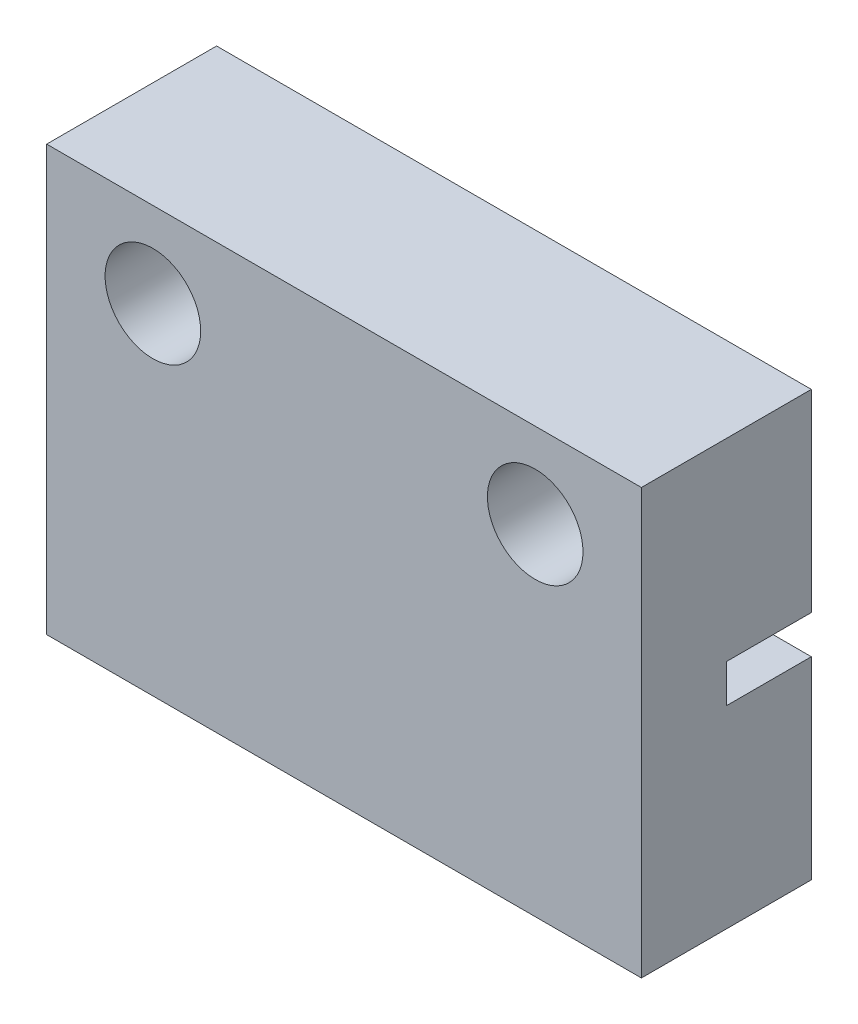
ISO-10303-21;
HEADER;
FILE_DESCRIPTION(('STEP AP214'),'2;1');
FILE_NAME('part.step','',(''),(''),'','','');
FILE_SCHEMA(('AUTOMOTIVE_DESIGN { 1 0 10303 214 1 1 1 1 }'));
ENDSEC;
DATA;
#1=APPLICATION_CONTEXT('core data for automotive mechanical design processes');
#2=APPLICATION_PROTOCOL_DEFINITION('international standard','automotive_design',2000,#1);
#3=PRODUCT_CONTEXT('',#1,'mechanical');
#4=PRODUCT('Part','Part','',(#3));
#5=PRODUCT_RELATED_PRODUCT_CATEGORY('part','',(#4));
#6=PRODUCT_DEFINITION_FORMATION('','',#4);
#7=PRODUCT_DEFINITION_CONTEXT('part definition',#1,'design');
#8=PRODUCT_DEFINITION('design','',#6,#7);
#9=PRODUCT_DEFINITION_SHAPE('','',#8);
#10=(LENGTH_UNIT() NAMED_UNIT(*) SI_UNIT(.MILLI.,.METRE.));
#11=(NAMED_UNIT(*) PLANE_ANGLE_UNIT() SI_UNIT($,.RADIAN.));
#12=(NAMED_UNIT(*) SI_UNIT($,.STERADIAN.) SOLID_ANGLE_UNIT());
#13=UNCERTAINTY_MEASURE_WITH_UNIT(LENGTH_MEASURE(1.E-05),#10,'distance_accuracy_value','');
#14=(GEOMETRIC_REPRESENTATION_CONTEXT(3) GLOBAL_UNCERTAINTY_ASSIGNED_CONTEXT((#13)) GLOBAL_UNIT_ASSIGNED_CONTEXT((#10,
#11,#12)) REPRESENTATION_CONTEXT('',''));
#15=CARTESIAN_POINT('',(0.,0.,0.));
#16=DIRECTION('',(0.,0.,1.));
#17=DIRECTION('',(1.,0.,0.));
#18=AXIS2_PLACEMENT_3D('',#15,#16,#17);
#19=CARTESIAN_POINT('',(9.,6.,-1.));
#20=DIRECTION('',(0.,0.,1.));
#21=DIRECTION('',(1.,0.,0.));
#22=AXIS2_PLACEMENT_3D('',#19,#20,#21);
#23=CYLINDRICAL_SURFACE('',#22,2.25);
#24=CARTESIAN_POINT('',(9.,6.,8.));
#25=DIRECTION('',(0.,0.,1.));
#26=DIRECTION('',(1.,0.,0.));
#27=AXIS2_PLACEMENT_3D('',#24,#25,#26);
#28=CIRCLE('',#27,2.25);
#29=CARTESIAN_POINT('',(11.25,6.,8.));
#30=VERTEX_POINT('',#29);
#31=EDGE_CURVE('E111',#30,#30,#28,.T.);
#32=ORIENTED_EDGE('',*,*,#31,.T.);
#33=EDGE_LOOP('',(#32));
#34=FACE_BOUND('',#33,.T.);
#35=CARTESIAN_POINT('',(9.,6.,0.));
#36=DIRECTION('',(0.,0.,1.));
#37=DIRECTION('',(1.,0.,0.));
#38=AXIS2_PLACEMENT_3D('',#35,#36,#37);
#39=CIRCLE('',#38,2.25);
#40=CARTESIAN_POINT('',(11.25,6.,0.));
#41=VERTEX_POINT('',#40);
#42=EDGE_CURVE('E187',#41,#41,#39,.T.);
#43=ORIENTED_EDGE('',*,*,#42,.F.);
#44=EDGE_LOOP('',(#43));
#45=FACE_BOUND('',#44,.T.);
#46=ADVANCED_FACE('F16',(#34,#45),#23,.F.);
#47=CARTESIAN_POINT('',(-9.,6.,-1.));
#48=DIRECTION('',(0.,0.,1.));
#49=DIRECTION('',(1.,0.,0.));
#50=AXIS2_PLACEMENT_3D('',#47,#48,#49);
#51=CYLINDRICAL_SURFACE('',#50,2.25);
#52=CARTESIAN_POINT('',(-9.,6.,8.));
#53=DIRECTION('',(0.,0.,1.));
#54=DIRECTION('',(1.,0.,0.));
#55=AXIS2_PLACEMENT_3D('',#52,#53,#54);
#56=CIRCLE('',#55,2.25);
#57=CARTESIAN_POINT('',(-6.75,6.,8.));
#58=VERTEX_POINT('',#57);
#59=EDGE_CURVE('E137',#58,#58,#56,.T.);
#60=ORIENTED_EDGE('',*,*,#59,.T.);
#61=EDGE_LOOP('',(#60));
#62=FACE_BOUND('',#61,.T.);
#63=CARTESIAN_POINT('',(-9.,6.,0.));
#64=DIRECTION('',(0.,0.,1.));
#65=DIRECTION('',(1.,0.,0.));
#66=AXIS2_PLACEMENT_3D('',#63,#64,#65);
#67=CIRCLE('',#66,2.25);
#68=CARTESIAN_POINT('',(-6.75,6.,0.));
#69=VERTEX_POINT('',#68);
#70=EDGE_CURVE('E172',#69,#69,#67,.T.);
#71=ORIENTED_EDGE('',*,*,#70,.F.);
#72=EDGE_LOOP('',(#71));
#73=FACE_BOUND('',#72,.T.);
#74=ADVANCED_FACE('F242',(#62,#73),#51,.F.);
#75=CARTESIAN_POINT('',(14.,-10.,0.));
#76=DIRECTION('',(1.,0.,0.));
#77=DIRECTION('',(0.,1.,0.));
#78=AXIS2_PLACEMENT_3D('',#75,#76,#77);
#79=PLANE('',#78);
#80=DIRECTION('',(0.,1.,0.));
#81=VECTOR('',#80,1.);
#82=CARTESIAN_POINT('',(14.,-10.,8.));
#83=LINE('',#82,#81);
#84=CARTESIAN_POINT('',(14.,-10.,8.));
#85=VERTEX_POINT('',#84);
#86=CARTESIAN_POINT('',(14.,10.,8.));
#87=VERTEX_POINT('',#86);
#88=EDGE_CURVE('E159',#85,#87,#83,.T.);
#89=ORIENTED_EDGE('',*,*,#88,.F.);
#90=DIRECTION('',(0.,0.,1.));
#91=VECTOR('',#90,1.);
#92=CARTESIAN_POINT('',(14.,-10.,0.));
#93=LINE('',#92,#91);
#94=CARTESIAN_POINT('',(14.,-10.,0.));
#95=VERTEX_POINT('',#94);
#96=EDGE_CURVE('E10',#95,#85,#93,.T.);
#97=ORIENTED_EDGE('',*,*,#96,.F.);
#98=DIRECTION('',(0.,1.,0.));
#99=VECTOR('',#98,1.);
#100=CARTESIAN_POINT('',(14.,-10.,0.));
#101=LINE('',#100,#99);
#102=CARTESIAN_POINT('',(14.,-0.9,0.));
#103=VERTEX_POINT('',#102);
#104=EDGE_CURVE('E41',#95,#103,#101,.T.);
#105=ORIENTED_EDGE('',*,*,#104,.T.);
#106=DIRECTION('',(0.,0.,1.));
#107=VECTOR('',#106,1.);
#108=CARTESIAN_POINT('',(14.,-0.9,-0.5));
#109=LINE('',#108,#107);
#110=CARTESIAN_POINT('',(14.,-0.9,4.));
#111=VERTEX_POINT('',#110);
#112=EDGE_CURVE('E201',#103,#111,#109,.T.);
#113=ORIENTED_EDGE('',*,*,#112,.T.);
#114=DIRECTION('',(0.,-1.,0.));
#115=VECTOR('',#114,1.);
#116=CARTESIAN_POINT('',(14.,-5.45,4.));
#117=LINE('',#116,#115);
#118=CARTESIAN_POINT('',(14.,0.9,4.));
#119=VERTEX_POINT('',#118);
#120=EDGE_CURVE('E164',#119,#111,#117,.T.);
#121=ORIENTED_EDGE('',*,*,#120,.F.);
#122=DIRECTION('',(0.,0.,1.));
#123=VECTOR('',#122,1.);
#124=CARTESIAN_POINT('',(14.,0.9,-0.5));
#125=LINE('',#124,#123);
#126=CARTESIAN_POINT('',(14.,0.9,0.));
#127=VERTEX_POINT('',#126);
#128=EDGE_CURVE('E191',#127,#119,#125,.T.);
#129=ORIENTED_EDGE('',*,*,#128,.F.);
#130=DIRECTION('',(0.,1.,0.));
#131=VECTOR('',#130,1.);
#132=CARTESIAN_POINT('',(14.,-10.,0.));
#133=LINE('',#132,#131);
#134=CARTESIAN_POINT('',(14.,10.,0.));
#135=VERTEX_POINT('',#134);
#136=EDGE_CURVE('E173',#127,#135,#133,.T.);
#137=ORIENTED_EDGE('',*,*,#136,.T.);
#138=DIRECTION('',(0.,0.,1.));
#139=VECTOR('',#138,1.);
#140=CARTESIAN_POINT('',(14.,10.,0.));
#141=LINE('',#140,#139);
#142=EDGE_CURVE('E107',#135,#87,#141,.T.);
#143=ORIENTED_EDGE('',*,*,#142,.T.);
#144=EDGE_LOOP('',(#89,#97,#105,#113,#121,#129,#137,#143));
#145=FACE_BOUND('',#144,.T.);
#146=ADVANCED_FACE('F220',(#145),#79,.T.);
#147=CARTESIAN_POINT('',(-14.,-10.,0.));
#148=DIRECTION('',(0.,1.,0.));
#149=DIRECTION('',(1.,0.,0.));
#150=AXIS2_PLACEMENT_3D('',#147,#148,#149);
#151=PLANE('',#150);
#152=ORIENTED_EDGE('',*,*,#96,.T.);
#153=DIRECTION('',(1.,0.,0.));
#154=VECTOR('',#153,1.);
#155=CARTESIAN_POINT('',(-14.,-10.,8.));
#156=LINE('',#155,#154);
#157=CARTESIAN_POINT('',(-14.,-10.,8.));
#158=VERTEX_POINT('',#157);
#159=EDGE_CURVE('E155',#158,#85,#156,.T.);
#160=ORIENTED_EDGE('',*,*,#159,.F.);
#161=DIRECTION('',(0.,0.,1.));
#162=VECTOR('',#161,1.);
#163=CARTESIAN_POINT('',(-14.,-10.,0.));
#164=LINE('',#163,#162);
#165=CARTESIAN_POINT('',(-14.,-10.,0.));
#166=VERTEX_POINT('',#165);
#167=EDGE_CURVE('E154',#166,#158,#164,.T.);
#168=ORIENTED_EDGE('',*,*,#167,.F.);
#169=DIRECTION('',(1.,0.,0.));
#170=VECTOR('',#169,1.);
#171=CARTESIAN_POINT('',(-14.,-10.,0.));
#172=LINE('',#171,#170);
#173=EDGE_CURVE('E24',#166,#95,#172,.T.);
#174=ORIENTED_EDGE('',*,*,#173,.T.);
#175=EDGE_LOOP('',(#152,#160,#168,#174));
#176=FACE_BOUND('',#175,.T.);
#177=ADVANCED_FACE('F212',(#176),#151,.F.);
#178=CARTESIAN_POINT('',(-14.,-10.,0.));
#179=DIRECTION('',(0.,0.,1.));
#180=DIRECTION('',(1.,0.,0.));
#181=AXIS2_PLACEMENT_3D('',#178,#179,#180);
#182=PLANE('',#181);
#183=DIRECTION('',(-1.,0.,0.));
#184=VECTOR('',#183,1.);
#185=CARTESIAN_POINT('',(-14.5,-0.9,0.));
#186=LINE('',#185,#184);
#187=CARTESIAN_POINT('',(-14.,-0.9,0.));
#188=VERTEX_POINT('',#187);
#189=EDGE_CURVE('E204',#103,#188,#186,.T.);
#190=ORIENTED_EDGE('',*,*,#189,.F.);
#191=ORIENTED_EDGE('',*,*,#104,.F.);
#192=ORIENTED_EDGE('',*,*,#173,.F.);
#193=DIRECTION('',(0.,1.,0.));
#194=VECTOR('',#193,1.);
#195=CARTESIAN_POINT('',(-14.,-10.,0.));
#196=LINE('',#195,#194);
#197=EDGE_CURVE('E147',#166,#188,#196,.T.);
#198=ORIENTED_EDGE('',*,*,#197,.T.);
#199=EDGE_LOOP('',(#190,#191,#192,#198));
#200=FACE_BOUND('',#199,.T.);
#201=ADVANCED_FACE('F215',(#200),#182,.F.);
#202=CARTESIAN_POINT('',(-15.,-0.9,-1.));
#203=DIRECTION('',(0.,1.,0.));
#204=DIRECTION('',(1.,0.,0.));
#205=AXIS2_PLACEMENT_3D('',#202,#203,#204);
#206=PLANE('',#205);
#207=DIRECTION('',(1.,0.,0.));
#208=VECTOR('',#207,1.);
#209=CARTESIAN_POINT('',(-15.,-0.9,4.));
#210=LINE('',#209,#208);
#211=CARTESIAN_POINT('',(-14.,-0.9,4.));
#212=VERTEX_POINT('',#211);
#213=EDGE_CURVE('E168',#212,#111,#210,.T.);
#214=ORIENTED_EDGE('',*,*,#213,.T.);
#215=ORIENTED_EDGE('',*,*,#112,.F.);
#216=ORIENTED_EDGE('',*,*,#189,.T.);
#217=DIRECTION('',(0.,0.,1.));
#218=VECTOR('',#217,1.);
#219=CARTESIAN_POINT('',(-14.,-0.9,-0.5));
#220=LINE('',#219,#218);
#221=EDGE_CURVE('E143',#188,#212,#220,.T.);
#222=ORIENTED_EDGE('',*,*,#221,.T.);
#223=EDGE_LOOP('',(#214,#215,#216,#222));
#224=FACE_BOUND('',#223,.T.);
#225=ADVANCED_FACE('F219',(#224),#206,.T.);
#226=CARTESIAN_POINT('',(-15.,-0.9,4.));
#227=DIRECTION('',(0.,0.,1.));
#228=DIRECTION('',(1.,0.,0.));
#229=AXIS2_PLACEMENT_3D('',#226,#227,#228);
#230=PLANE('',#229);
#231=ORIENTED_EDGE('',*,*,#120,.T.);
#232=ORIENTED_EDGE('',*,*,#213,.F.);
#233=DIRECTION('',(0.,-1.,0.));
#234=VECTOR('',#233,1.);
#235=CARTESIAN_POINT('',(-14.,-5.45,4.));
#236=LINE('',#235,#234);
#237=CARTESIAN_POINT('',(-14.,0.9,4.));
#238=VERTEX_POINT('',#237);
#239=EDGE_CURVE('E142',#238,#212,#236,.T.);
#240=ORIENTED_EDGE('',*,*,#239,.F.);
#241=DIRECTION('',(1.,0.,0.));
#242=VECTOR('',#241,1.);
#243=CARTESIAN_POINT('',(-15.,0.9,4.));
#244=LINE('',#243,#242);
#245=EDGE_CURVE('E169',#238,#119,#244,.T.);
#246=ORIENTED_EDGE('',*,*,#245,.T.);
#247=EDGE_LOOP('',(#231,#232,#240,#246));
#248=FACE_BOUND('',#247,.T.);
#249=ADVANCED_FACE('F223',(#248),#230,.F.);
#250=CARTESIAN_POINT('',(-15.,0.9,-1.));
#251=DIRECTION('',(0.,1.,0.));
#252=DIRECTION('',(1.,0.,0.));
#253=AXIS2_PLACEMENT_3D('',#250,#251,#252);
#254=PLANE('',#253);
#255=DIRECTION('',(0.,0.,1.));
#256=VECTOR('',#255,1.);
#257=CARTESIAN_POINT('',(-14.,0.9,-0.5));
#258=LINE('',#257,#256);
#259=CARTESIAN_POINT('',(-14.,0.9,0.));
#260=VERTEX_POINT('',#259);
#261=EDGE_CURVE('E122',#260,#238,#258,.T.);
#262=ORIENTED_EDGE('',*,*,#261,.F.);
#263=DIRECTION('',(-1.,0.,0.));
#264=VECTOR('',#263,1.);
#265=CARTESIAN_POINT('',(-14.5,0.9,0.));
#266=LINE('',#265,#264);
#267=EDGE_CURVE('E117',#127,#260,#266,.T.);
#268=ORIENTED_EDGE('',*,*,#267,.F.);
#269=ORIENTED_EDGE('',*,*,#128,.T.);
#270=ORIENTED_EDGE('',*,*,#245,.F.);
#271=EDGE_LOOP('',(#262,#268,#269,#270));
#272=FACE_BOUND('',#271,.T.);
#273=ADVANCED_FACE('F225',(#272),#254,.F.);
#274=CARTESIAN_POINT('',(-14.,-10.,0.));
#275=DIRECTION('',(0.,0.,1.));
#276=DIRECTION('',(1.,0.,0.));
#277=AXIS2_PLACEMENT_3D('',#274,#275,#276);
#278=PLANE('',#277);
#279=ORIENTED_EDGE('',*,*,#42,.T.);
#280=EDGE_LOOP('',(#279));
#281=FACE_BOUND('',#280,.T.);
#282=ORIENTED_EDGE('',*,*,#70,.T.);
#283=EDGE_LOOP('',(#282));
#284=FACE_BOUND('',#283,.T.);
#285=DIRECTION('',(1.,0.,0.));
#286=VECTOR('',#285,1.);
#287=CARTESIAN_POINT('',(-14.,10.,0.));
#288=LINE('',#287,#286);
#289=CARTESIAN_POINT('',(-14.,10.,0.));
#290=VERTEX_POINT('',#289);
#291=EDGE_CURVE('E101',#290,#135,#288,.T.);
#292=ORIENTED_EDGE('',*,*,#291,.T.);
#293=ORIENTED_EDGE('',*,*,#136,.F.);
#294=ORIENTED_EDGE('',*,*,#267,.T.);
#295=DIRECTION('',(0.,1.,0.));
#296=VECTOR('',#295,1.);
#297=CARTESIAN_POINT('',(-14.,-10.,0.));
#298=LINE('',#297,#296);
#299=EDGE_CURVE('E114',#260,#290,#298,.T.);
#300=ORIENTED_EDGE('',*,*,#299,.T.);
#301=EDGE_LOOP('',(#292,#293,#294,#300));
#302=FACE_BOUND('',#301,.T.);
#303=ADVANCED_FACE('F115',(#281,#284,#302),#278,.F.);
#304=CARTESIAN_POINT('',(-14.,10.,0.));
#305=DIRECTION('',(0.,1.,0.));
#306=DIRECTION('',(1.,0.,0.));
#307=AXIS2_PLACEMENT_3D('',#304,#305,#306);
#308=PLANE('',#307);
#309=ORIENTED_EDGE('',*,*,#291,.F.);
#310=DIRECTION('',(0.,0.,1.));
#311=VECTOR('',#310,1.);
#312=CARTESIAN_POINT('',(-14.,10.,0.));
#313=LINE('',#312,#311);
#314=CARTESIAN_POINT('',(-14.,10.,8.));
#315=VERTEX_POINT('',#314);
#316=EDGE_CURVE('E106',#290,#315,#313,.T.);
#317=ORIENTED_EDGE('',*,*,#316,.T.);
#318=DIRECTION('',(1.,0.,0.));
#319=VECTOR('',#318,1.);
#320=CARTESIAN_POINT('',(-14.,10.,8.));
#321=LINE('',#320,#319);
#322=EDGE_CURVE('E136',#315,#87,#321,.T.);
#323=ORIENTED_EDGE('',*,*,#322,.T.);
#324=ORIENTED_EDGE('',*,*,#142,.F.);
#325=EDGE_LOOP('',(#309,#317,#323,#324));
#326=FACE_BOUND('',#325,.T.);
#327=ADVANCED_FACE('F103',(#326),#308,.T.);
#328=CARTESIAN_POINT('',(-14.,-10.,8.));
#329=DIRECTION('',(0.,0.,1.));
#330=DIRECTION('',(1.,0.,0.));
#331=AXIS2_PLACEMENT_3D('',#328,#329,#330);
#332=PLANE('',#331);
#333=ORIENTED_EDGE('',*,*,#31,.F.);
#334=EDGE_LOOP('',(#333));
#335=FACE_BOUND('',#334,.T.);
#336=ORIENTED_EDGE('',*,*,#59,.F.);
#337=EDGE_LOOP('',(#336));
#338=FACE_BOUND('',#337,.T.);
#339=DIRECTION('',(0.,1.,0.));
#340=VECTOR('',#339,1.);
#341=CARTESIAN_POINT('',(-14.,-10.,8.));
#342=LINE('',#341,#340);
#343=EDGE_CURVE('E128',#158,#315,#342,.T.);
#344=ORIENTED_EDGE('',*,*,#343,.F.);
#345=ORIENTED_EDGE('',*,*,#159,.T.);
#346=ORIENTED_EDGE('',*,*,#88,.T.);
#347=ORIENTED_EDGE('',*,*,#322,.F.);
#348=EDGE_LOOP('',(#344,#345,#346,#347));
#349=FACE_BOUND('',#348,.T.);
#350=ADVANCED_FACE('F227',(#335,#338,#349),#332,.T.);
#351=CARTESIAN_POINT('',(-14.,-10.,0.));
#352=DIRECTION('',(1.,0.,0.));
#353=DIRECTION('',(0.,1.,0.));
#354=AXIS2_PLACEMENT_3D('',#351,#352,#353);
#355=PLANE('',#354);
#356=ORIENTED_EDGE('',*,*,#316,.F.);
#357=ORIENTED_EDGE('',*,*,#299,.F.);
#358=ORIENTED_EDGE('',*,*,#261,.T.);
#359=ORIENTED_EDGE('',*,*,#239,.T.);
#360=ORIENTED_EDGE('',*,*,#221,.F.);
#361=ORIENTED_EDGE('',*,*,#197,.F.);
#362=ORIENTED_EDGE('',*,*,#167,.T.);
#363=ORIENTED_EDGE('',*,*,#343,.T.);
#364=EDGE_LOOP('',(#356,#357,#358,#359,#360,#361,#362,#363));
#365=FACE_BOUND('',#364,.T.);
#366=ADVANCED_FACE('F125',(#365),#355,.F.);
#367=CLOSED_SHELL('',(#46,#74,#146,#177,#201,#225,#249,#273,#303,#327,#350,#366));
#368=MANIFOLD_SOLID_BREP('B1',#367);
#369=ADVANCED_BREP_SHAPE_REPRESENTATION('',(#18,#368),#14);
#370=SHAPE_DEFINITION_REPRESENTATION(#9,#369);
ENDSEC;
END-ISO-10303-21;
